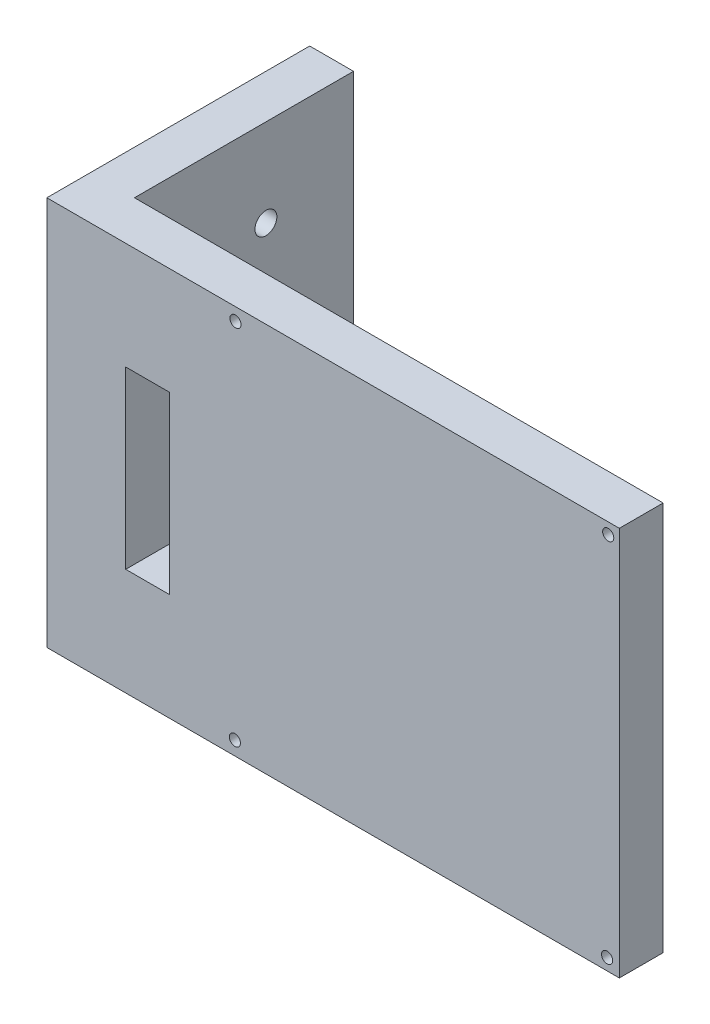
ISO-10303-21;
HEADER;
FILE_DESCRIPTION(('STEP AP214'),'2;1');
FILE_NAME('part.step','',(''),(''),'','','');
FILE_SCHEMA(('AUTOMOTIVE_DESIGN { 1 0 10303 214 1 1 1 1 }'));
ENDSEC;
DATA;
#1=APPLICATION_CONTEXT('core data for automotive mechanical design processes');
#2=APPLICATION_PROTOCOL_DEFINITION('international standard','automotive_design',2000,#1);
#3=PRODUCT_CONTEXT('',#1,'mechanical');
#4=PRODUCT('Part','Part','',(#3));
#5=PRODUCT_RELATED_PRODUCT_CATEGORY('part','',(#4));
#6=PRODUCT_DEFINITION_FORMATION('','',#4);
#7=PRODUCT_DEFINITION_CONTEXT('part definition',#1,'design');
#8=PRODUCT_DEFINITION('design','',#6,#7);
#9=PRODUCT_DEFINITION_SHAPE('','',#8);
#10=(LENGTH_UNIT() NAMED_UNIT(*) SI_UNIT(.MILLI.,.METRE.));
#11=(NAMED_UNIT(*) PLANE_ANGLE_UNIT() SI_UNIT($,.RADIAN.));
#12=(NAMED_UNIT(*) SI_UNIT($,.STERADIAN.) SOLID_ANGLE_UNIT());
#13=UNCERTAINTY_MEASURE_WITH_UNIT(LENGTH_MEASURE(1.E-05),#10,'distance_accuracy_value','');
#14=(GEOMETRIC_REPRESENTATION_CONTEXT(3) GLOBAL_UNCERTAINTY_ASSIGNED_CONTEXT((#13)) GLOBAL_UNIT_ASSIGNED_CONTEXT((#10,
#11,#12)) REPRESENTATION_CONTEXT('',''));
#15=CARTESIAN_POINT('',(0.,0.,0.));
#16=DIRECTION('',(0.,0.,1.));
#17=DIRECTION('',(1.,0.,0.));
#18=AXIS2_PLACEMENT_3D('',#15,#16,#17);
#19=CARTESIAN_POINT('',(0.,0.,10.));
#20=DIRECTION('',(0.,0.,1.));
#21=DIRECTION('',(1.,0.,0.));
#22=AXIS2_PLACEMENT_3D('',#19,#20,#21);
#23=PLANE('',#22);
#24=DIRECTION('',(0.,1.,0.));
#25=VECTOR('',#24,1.);
#26=CARTESIAN_POINT('',(-12.,64.45,10.));
#27=LINE('',#26,#25);
#28=CARTESIAN_POINT('',(-12.,24.45,10.));
#29=VERTEX_POINT('',#28);
#30=CARTESIAN_POINT('',(-12.,64.45,10.));
#31=VERTEX_POINT('',#30);
#32=EDGE_CURVE('E54',#29,#31,#27,.T.);
#33=ORIENTED_EDGE('',*,*,#32,.F.);
#34=DIRECTION('',(1.,0.,0.));
#35=VECTOR('',#34,1.);
#36=CARTESIAN_POINT('',(-22.,24.45,10.));
#37=LINE('',#36,#35);
#38=CARTESIAN_POINT('',(-22.,24.45,10.));
#39=VERTEX_POINT('',#38);
#40=EDGE_CURVE('E174',#39,#29,#37,.T.);
#41=ORIENTED_EDGE('',*,*,#40,.F.);
#42=DIRECTION('',(0.,-1.,0.));
#43=VECTOR('',#42,1.);
#44=CARTESIAN_POINT('',(-22.,64.45,10.));
#45=LINE('',#44,#43);
#46=CARTESIAN_POINT('',(-22.,64.45,10.));
#47=VERTEX_POINT('',#46);
#48=EDGE_CURVE('E191',#47,#39,#45,.T.);
#49=ORIENTED_EDGE('',*,*,#48,.F.);
#50=DIRECTION('',(-1.,0.,0.));
#51=VECTOR('',#50,1.);
#52=CARTESIAN_POINT('',(-22.,64.45,10.));
#53=LINE('',#52,#51);
#54=EDGE_CURVE('E187',#31,#47,#53,.T.);
#55=ORIENTED_EDGE('',*,*,#54,.F.);
#56=EDGE_LOOP('',(#33,#41,#49,#55));
#57=FACE_BOUND('',#56,.T.);
#58=CARTESIAN_POINT('',(87.884,2.66700000000001,10.));
#59=DIRECTION('',(0.,0.,1.));
#60=DIRECTION('',(1.,0.,0.));
#61=AXIS2_PLACEMENT_3D('',#58,#59,#60);
#62=CIRCLE('',#61,1.26999999999999);
#63=CARTESIAN_POINT('',(89.154,2.66700000000001,10.));
#64=VERTEX_POINT('',#63);
#65=EDGE_CURVE('E222',#64,#64,#62,.T.);
#66=ORIENTED_EDGE('',*,*,#65,.F.);
#67=EDGE_LOOP('',(#66));
#68=FACE_BOUND('',#67,.T.);
#69=CARTESIAN_POINT('',(2.92099999999999,3.17500000000001,10.));
#70=DIRECTION('',(0.,0.,1.));
#71=DIRECTION('',(1.,0.,0.));
#72=AXIS2_PLACEMENT_3D('',#69,#70,#71);
#73=CIRCLE('',#72,1.27000000000001);
#74=CARTESIAN_POINT('',(4.191,3.17500000000001,10.));
#75=VERTEX_POINT('',#74);
#76=EDGE_CURVE('E238',#75,#75,#73,.T.);
#77=ORIENTED_EDGE('',*,*,#76,.F.);
#78=EDGE_LOOP('',(#77));
#79=FACE_BOUND('',#78,.T.);
#80=DIRECTION('',(-1.,0.,0.));
#81=VECTOR('',#80,1.);
#82=CARTESIAN_POINT('',(90.678,88.9,10.));
#83=LINE('',#82,#81);
#84=CARTESIAN_POINT('',(90.678,88.9,10.));
#85=VERTEX_POINT('',#84);
#86=CARTESIAN_POINT('',(-40.,88.9,10.));
#87=VERTEX_POINT('',#86);
#88=EDGE_CURVE('E116',#85,#87,#83,.T.);
#89=ORIENTED_EDGE('',*,*,#88,.T.);
#90=DIRECTION('',(0.,1.,0.));
#91=VECTOR('',#90,1.);
#92=CARTESIAN_POINT('',(-40.,88.9,10.));
#93=LINE('',#92,#91);
#94=CARTESIAN_POINT('',(-40.,0.,10.));
#95=VERTEX_POINT('',#94);
#96=EDGE_CURVE('E120',#95,#87,#93,.T.);
#97=ORIENTED_EDGE('',*,*,#96,.F.);
#98=DIRECTION('',(1.,0.,0.));
#99=VECTOR('',#98,1.);
#100=CARTESIAN_POINT('',(0.,0.,10.));
#101=LINE('',#100,#99);
#102=CARTESIAN_POINT('',(90.678,0.,10.));
#103=VERTEX_POINT('',#102);
#104=EDGE_CURVE('E246',#95,#103,#101,.T.);
#105=ORIENTED_EDGE('',*,*,#104,.T.);
#106=DIRECTION('',(0.,1.,0.));
#107=VECTOR('',#106,1.);
#108=CARTESIAN_POINT('',(90.678,0.,10.));
#109=LINE('',#108,#107);
#110=EDGE_CURVE('E122',#103,#85,#109,.T.);
#111=ORIENTED_EDGE('',*,*,#110,.T.);
#112=EDGE_LOOP('',(#89,#97,#105,#111));
#113=FACE_BOUND('',#112,.T.);
#114=CARTESIAN_POINT('',(3.048,85.979,10.));
#115=DIRECTION('',(0.,0.,1.));
#116=DIRECTION('',(1.,0.,0.));
#117=AXIS2_PLACEMENT_3D('',#114,#115,#116);
#118=CIRCLE('',#117,1.26999999999999);
#119=CARTESIAN_POINT('',(4.31799999999999,85.979,10.));
#120=VERTEX_POINT('',#119);
#121=EDGE_CURVE('E230',#120,#120,#118,.T.);
#122=ORIENTED_EDGE('',*,*,#121,.F.);
#123=EDGE_LOOP('',(#122));
#124=FACE_BOUND('',#123,.T.);
#125=CARTESIAN_POINT('',(88.138,86.36,10.));
#126=DIRECTION('',(0.,0.,1.));
#127=DIRECTION('',(1.,0.,0.));
#128=AXIS2_PLACEMENT_3D('',#125,#126,#127);
#129=CIRCLE('',#128,1.26999999999999);
#130=CARTESIAN_POINT('',(89.408,86.36,10.));
#131=VERTEX_POINT('',#130);
#132=EDGE_CURVE('E214',#131,#131,#129,.T.);
#133=ORIENTED_EDGE('',*,*,#132,.F.);
#134=EDGE_LOOP('',(#133));
#135=FACE_BOUND('',#134,.T.);
#136=ADVANCED_FACE('F38',(#57,#68,#79,#113,#124,#135),#23,.T.);
#137=CARTESIAN_POINT('',(0.,0.,0.));
#138=DIRECTION('',(0.,0.,1.));
#139=DIRECTION('',(1.,0.,0.));
#140=AXIS2_PLACEMENT_3D('',#137,#138,#139);
#141=PLANE('',#140);
#142=DIRECTION('',(1.,0.,0.));
#143=VECTOR('',#142,1.);
#144=CARTESIAN_POINT('',(-22.,24.45,0.));
#145=LINE('',#144,#143);
#146=CARTESIAN_POINT('',(-22.,24.45,0.));
#147=VERTEX_POINT('',#146);
#148=CARTESIAN_POINT('',(-12.,24.45,0.));
#149=VERTEX_POINT('',#148);
#150=EDGE_CURVE('E180',#147,#149,#145,.T.);
#151=ORIENTED_EDGE('',*,*,#150,.T.);
#152=DIRECTION('',(0.,1.,0.));
#153=VECTOR('',#152,1.);
#154=CARTESIAN_POINT('',(-12.,64.45,0.));
#155=LINE('',#154,#153);
#156=CARTESIAN_POINT('',(-12.,64.45,0.));
#157=VERTEX_POINT('',#156);
#158=EDGE_CURVE('E169',#149,#157,#155,.T.);
#159=ORIENTED_EDGE('',*,*,#158,.T.);
#160=DIRECTION('',(-1.,0.,0.));
#161=VECTOR('',#160,1.);
#162=CARTESIAN_POINT('',(-22.,64.45,0.));
#163=LINE('',#162,#161);
#164=CARTESIAN_POINT('',(-22.,64.45,0.));
#165=VERTEX_POINT('',#164);
#166=EDGE_CURVE('E173',#157,#165,#163,.T.);
#167=ORIENTED_EDGE('',*,*,#166,.T.);
#168=DIRECTION('',(0.,-1.,0.));
#169=VECTOR('',#168,1.);
#170=CARTESIAN_POINT('',(-22.,64.45,0.));
#171=LINE('',#170,#169);
#172=EDGE_CURVE('E62',#165,#147,#171,.T.);
#173=ORIENTED_EDGE('',*,*,#172,.T.);
#174=EDGE_LOOP('',(#151,#159,#167,#173));
#175=FACE_BOUND('',#174,.T.);
#176=DIRECTION('',(1.,0.,0.));
#177=VECTOR('',#176,1.);
#178=CARTESIAN_POINT('',(0.,0.,0.));
#179=LINE('',#178,#177);
#180=CARTESIAN_POINT('',(-30.,0.,0.));
#181=VERTEX_POINT('',#180);
#182=CARTESIAN_POINT('',(90.678,0.,0.));
#183=VERTEX_POINT('',#182);
#184=EDGE_CURVE('E242',#181,#183,#179,.T.);
#185=ORIENTED_EDGE('',*,*,#184,.F.);
#186=DIRECTION('',(0.,-1.,0.));
#187=VECTOR('',#186,1.);
#188=CARTESIAN_POINT('',(-30.,88.9,0.));
#189=LINE('',#188,#187);
#190=CARTESIAN_POINT('',(-30.,88.9,0.));
#191=VERTEX_POINT('',#190);
#192=EDGE_CURVE('E201',#191,#181,#189,.T.);
#193=ORIENTED_EDGE('',*,*,#192,.F.);
#194=DIRECTION('',(-1.,0.,0.));
#195=VECTOR('',#194,1.);
#196=CARTESIAN_POINT('',(90.678,88.9,0.));
#197=LINE('',#196,#195);
#198=CARTESIAN_POINT('',(90.678,88.9,0.));
#199=VERTEX_POINT('',#198);
#200=EDGE_CURVE('E249',#199,#191,#197,.T.);
#201=ORIENTED_EDGE('',*,*,#200,.F.);
#202=DIRECTION('',(0.,1.,0.));
#203=VECTOR('',#202,1.);
#204=CARTESIAN_POINT('',(90.678,0.,0.));
#205=LINE('',#204,#203);
#206=EDGE_CURVE('E254',#183,#199,#205,.T.);
#207=ORIENTED_EDGE('',*,*,#206,.F.);
#208=EDGE_LOOP('',(#185,#193,#201,#207));
#209=FACE_BOUND('',#208,.T.);
#210=CARTESIAN_POINT('',(2.92099999999999,3.17500000000001,0.));
#211=DIRECTION('',(0.,0.,1.));
#212=DIRECTION('',(1.,0.,0.));
#213=AXIS2_PLACEMENT_3D('',#210,#211,#212);
#214=CIRCLE('',#213,1.27000000000001);
#215=CARTESIAN_POINT('',(4.191,3.17500000000001,0.));
#216=VERTEX_POINT('',#215);
#217=EDGE_CURVE('E234',#216,#216,#214,.T.);
#218=ORIENTED_EDGE('',*,*,#217,.T.);
#219=EDGE_LOOP('',(#218));
#220=FACE_BOUND('',#219,.T.);
#221=CARTESIAN_POINT('',(3.048,85.979,0.));
#222=DIRECTION('',(0.,0.,1.));
#223=DIRECTION('',(1.,0.,0.));
#224=AXIS2_PLACEMENT_3D('',#221,#222,#223);
#225=CIRCLE('',#224,1.26999999999999);
#226=CARTESIAN_POINT('',(4.31799999999999,85.979,0.));
#227=VERTEX_POINT('',#226);
#228=EDGE_CURVE('E226',#227,#227,#225,.T.);
#229=ORIENTED_EDGE('',*,*,#228,.T.);
#230=EDGE_LOOP('',(#229));
#231=FACE_BOUND('',#230,.T.);
#232=CARTESIAN_POINT('',(87.884,2.66700000000001,0.));
#233=DIRECTION('',(0.,0.,1.));
#234=DIRECTION('',(1.,0.,0.));
#235=AXIS2_PLACEMENT_3D('',#232,#233,#234);
#236=CIRCLE('',#235,1.26999999999999);
#237=CARTESIAN_POINT('',(89.154,2.66700000000001,0.));
#238=VERTEX_POINT('',#237);
#239=EDGE_CURVE('E218',#238,#238,#236,.T.);
#240=ORIENTED_EDGE('',*,*,#239,.T.);
#241=EDGE_LOOP('',(#240));
#242=FACE_BOUND('',#241,.T.);
#243=CARTESIAN_POINT('',(88.138,86.36,0.));
#244=DIRECTION('',(0.,0.,1.));
#245=DIRECTION('',(1.,0.,0.));
#246=AXIS2_PLACEMENT_3D('',#243,#244,#245);
#247=CIRCLE('',#246,1.26999999999999);
#248=CARTESIAN_POINT('',(89.408,86.36,0.));
#249=VERTEX_POINT('',#248);
#250=EDGE_CURVE('E213',#249,#249,#247,.T.);
#251=ORIENTED_EDGE('',*,*,#250,.T.);
#252=EDGE_LOOP('',(#251));
#253=FACE_BOUND('',#252,.T.);
#254=ADVANCED_FACE('F264',(#175,#209,#220,#231,#242,#253),#141,.F.);
#255=CARTESIAN_POINT('',(0.,0.,10.));
#256=DIRECTION('',(0.,1.,0.));
#257=DIRECTION('',(0.,0.,1.));
#258=AXIS2_PLACEMENT_3D('',#255,#256,#257);
#259=PLANE('',#258);
#260=ORIENTED_EDGE('',*,*,#184,.T.);
#261=DIRECTION('',(0.,0.,-1.));
#262=VECTOR('',#261,1.);
#263=CARTESIAN_POINT('',(90.678,0.,10.));
#264=LINE('',#263,#262);
#265=EDGE_CURVE('E11',#103,#183,#264,.T.);
#266=ORIENTED_EDGE('',*,*,#265,.F.);
#267=ORIENTED_EDGE('',*,*,#104,.F.);
#268=DIRECTION('',(0.,0.,1.));
#269=VECTOR('',#268,1.);
#270=CARTESIAN_POINT('',(-40.,0.,10.));
#271=LINE('',#270,#269);
#272=CARTESIAN_POINT('',(-40.,0.,-50.));
#273=VERTEX_POINT('',#272);
#274=EDGE_CURVE('E141',#273,#95,#271,.T.);
#275=ORIENTED_EDGE('',*,*,#274,.F.);
#276=DIRECTION('',(1.,0.,0.));
#277=VECTOR('',#276,1.);
#278=CARTESIAN_POINT('',(-40.,0.,-50.));
#279=LINE('',#278,#277);
#280=CARTESIAN_POINT('',(-30.,0.,-50.));
#281=VERTEX_POINT('',#280);
#282=EDGE_CURVE('E157',#273,#281,#279,.T.);
#283=ORIENTED_EDGE('',*,*,#282,.T.);
#284=DIRECTION('',(0.,0.,1.));
#285=VECTOR('',#284,1.);
#286=CARTESIAN_POINT('',(-30.,0.,10.));
#287=LINE('',#286,#285);
#288=EDGE_CURVE('E143',#281,#181,#287,.T.);
#289=ORIENTED_EDGE('',*,*,#288,.T.);
#290=EDGE_LOOP('',(#260,#266,#267,#275,#283,#289));
#291=FACE_BOUND('',#290,.T.);
#292=ADVANCED_FACE('F40',(#291),#259,.F.);
#293=CARTESIAN_POINT('',(90.678,0.,10.));
#294=DIRECTION('',(-1.,0.,0.));
#295=DIRECTION('',(0.,0.,1.));
#296=AXIS2_PLACEMENT_3D('',#293,#294,#295);
#297=PLANE('',#296);
#298=ORIENTED_EDGE('',*,*,#206,.T.);
#299=DIRECTION('',(0.,0.,-1.));
#300=VECTOR('',#299,1.);
#301=CARTESIAN_POINT('',(90.678,88.9,10.));
#302=LINE('',#301,#300);
#303=EDGE_CURVE('E47',#85,#199,#302,.T.);
#304=ORIENTED_EDGE('',*,*,#303,.F.);
#305=ORIENTED_EDGE('',*,*,#110,.F.);
#306=ORIENTED_EDGE('',*,*,#265,.T.);
#307=EDGE_LOOP('',(#298,#304,#305,#306));
#308=FACE_BOUND('',#307,.T.);
#309=ADVANCED_FACE('F276',(#308),#297,.F.);
#310=CARTESIAN_POINT('',(90.678,88.9,10.));
#311=DIRECTION('',(0.,-1.,0.));
#312=DIRECTION('',(0.,0.,-1.));
#313=AXIS2_PLACEMENT_3D('',#310,#311,#312);
#314=PLANE('',#313);
#315=ORIENTED_EDGE('',*,*,#200,.T.);
#316=DIRECTION('',(0.,0.,-1.));
#317=VECTOR('',#316,1.);
#318=CARTESIAN_POINT('',(-30.,88.9,10.));
#319=LINE('',#318,#317);
#320=CARTESIAN_POINT('',(-30.,88.9,-50.));
#321=VERTEX_POINT('',#320);
#322=EDGE_CURVE('E158',#191,#321,#319,.T.);
#323=ORIENTED_EDGE('',*,*,#322,.T.);
#324=DIRECTION('',(1.,0.,0.));
#325=VECTOR('',#324,1.);
#326=CARTESIAN_POINT('',(-40.,88.9,-50.));
#327=LINE('',#326,#325);
#328=CARTESIAN_POINT('',(-40.,88.9,-50.));
#329=VERTEX_POINT('',#328);
#330=EDGE_CURVE('E132',#329,#321,#327,.T.);
#331=ORIENTED_EDGE('',*,*,#330,.F.);
#332=DIRECTION('',(0.,0.,-1.));
#333=VECTOR('',#332,1.);
#334=CARTESIAN_POINT('',(-40.,88.9,10.));
#335=LINE('',#334,#333);
#336=EDGE_CURVE('E129',#87,#329,#335,.T.);
#337=ORIENTED_EDGE('',*,*,#336,.F.);
#338=ORIENTED_EDGE('',*,*,#88,.F.);
#339=ORIENTED_EDGE('',*,*,#303,.T.);
#340=EDGE_LOOP('',(#315,#323,#331,#337,#338,#339));
#341=FACE_BOUND('',#340,.T.);
#342=ADVANCED_FACE('F130',(#341),#314,.F.);
#343=CARTESIAN_POINT('',(2.92099999999999,3.17500000000001,10.));
#344=DIRECTION('',(0.,0.,-1.));
#345=DIRECTION('',(-1.,0.,0.));
#346=AXIS2_PLACEMENT_3D('',#343,#344,#345);
#347=CYLINDRICAL_SURFACE('',#346,1.27000000000001);
#348=ORIENTED_EDGE('',*,*,#76,.T.);
#349=EDGE_LOOP('',(#348));
#350=FACE_BOUND('',#349,.T.);
#351=ORIENTED_EDGE('',*,*,#217,.F.);
#352=EDGE_LOOP('',(#351));
#353=FACE_BOUND('',#352,.T.);
#354=ADVANCED_FACE('F282',(#350,#353),#347,.F.);
#355=CARTESIAN_POINT('',(3.048,85.979,10.));
#356=DIRECTION('',(0.,0.,-1.));
#357=DIRECTION('',(-1.,0.,0.));
#358=AXIS2_PLACEMENT_3D('',#355,#356,#357);
#359=CYLINDRICAL_SURFACE('',#358,1.26999999999999);
#360=ORIENTED_EDGE('',*,*,#121,.T.);
#361=EDGE_LOOP('',(#360));
#362=FACE_BOUND('',#361,.T.);
#363=ORIENTED_EDGE('',*,*,#228,.F.);
#364=EDGE_LOOP('',(#363));
#365=FACE_BOUND('',#364,.T.);
#366=ADVANCED_FACE('F296',(#362,#365),#359,.F.);
#367=CARTESIAN_POINT('',(87.884,2.66700000000001,10.));
#368=DIRECTION('',(0.,0.,-1.));
#369=DIRECTION('',(-1.,0.,0.));
#370=AXIS2_PLACEMENT_3D('',#367,#368,#369);
#371=CYLINDRICAL_SURFACE('',#370,1.26999999999999);
#372=ORIENTED_EDGE('',*,*,#65,.T.);
#373=EDGE_LOOP('',(#372));
#374=FACE_BOUND('',#373,.T.);
#375=ORIENTED_EDGE('',*,*,#239,.F.);
#376=EDGE_LOOP('',(#375));
#377=FACE_BOUND('',#376,.T.);
#378=ADVANCED_FACE('F300',(#374,#377),#371,.F.);
#379=CARTESIAN_POINT('',(88.138,86.36,10.));
#380=DIRECTION('',(0.,0.,-1.));
#381=DIRECTION('',(-1.,0.,0.));
#382=AXIS2_PLACEMENT_3D('',#379,#380,#381);
#383=CYLINDRICAL_SURFACE('',#382,1.26999999999999);
#384=ORIENTED_EDGE('',*,*,#132,.T.);
#385=EDGE_LOOP('',(#384));
#386=FACE_BOUND('',#385,.T.);
#387=ORIENTED_EDGE('',*,*,#250,.F.);
#388=EDGE_LOOP('',(#387));
#389=FACE_BOUND('',#388,.T.);
#390=ADVANCED_FACE('F304',(#386,#389),#383,.F.);
#391=CARTESIAN_POINT('',(-12.,64.45,0.));
#392=DIRECTION('',(1.,0.,0.));
#393=DIRECTION('',(0.,1.,0.));
#394=AXIS2_PLACEMENT_3D('',#391,#392,#393);
#395=PLANE('',#394);
#396=ORIENTED_EDGE('',*,*,#32,.T.);
#397=DIRECTION('',(0.,0.,1.));
#398=VECTOR('',#397,1.);
#399=CARTESIAN_POINT('',(-12.,64.45,0.));
#400=LINE('',#399,#398);
#401=EDGE_CURVE('E184',#157,#31,#400,.T.);
#402=ORIENTED_EDGE('',*,*,#401,.F.);
#403=ORIENTED_EDGE('',*,*,#158,.F.);
#404=DIRECTION('',(0.,0.,1.));
#405=VECTOR('',#404,1.);
#406=CARTESIAN_POINT('',(-12.,24.45,0.));
#407=LINE('',#406,#405);
#408=EDGE_CURVE('E198',#149,#29,#407,.T.);
#409=ORIENTED_EDGE('',*,*,#408,.T.);
#410=EDGE_LOOP('',(#396,#402,#403,#409));
#411=FACE_BOUND('',#410,.T.);
#412=ADVANCED_FACE('F308',(#411),#395,.F.);
#413=CARTESIAN_POINT('',(-22.,24.45,0.));
#414=DIRECTION('',(0.,-1.,0.));
#415=DIRECTION('',(0.,0.,-1.));
#416=AXIS2_PLACEMENT_3D('',#413,#414,#415);
#417=PLANE('',#416);
#418=ORIENTED_EDGE('',*,*,#40,.T.);
#419=ORIENTED_EDGE('',*,*,#408,.F.);
#420=ORIENTED_EDGE('',*,*,#150,.F.);
#421=DIRECTION('',(0.,0.,1.));
#422=VECTOR('',#421,1.);
#423=CARTESIAN_POINT('',(-22.,24.45,0.));
#424=LINE('',#423,#422);
#425=EDGE_CURVE('E202',#147,#39,#424,.T.);
#426=ORIENTED_EDGE('',*,*,#425,.T.);
#427=EDGE_LOOP('',(#418,#419,#420,#426));
#428=FACE_BOUND('',#427,.T.);
#429=ADVANCED_FACE('F312',(#428),#417,.F.);
#430=CARTESIAN_POINT('',(-22.,64.45,0.));
#431=DIRECTION('',(-1.,0.,0.));
#432=DIRECTION('',(0.,-1.,0.));
#433=AXIS2_PLACEMENT_3D('',#430,#431,#432);
#434=PLANE('',#433);
#435=ORIENTED_EDGE('',*,*,#48,.T.);
#436=ORIENTED_EDGE('',*,*,#425,.F.);
#437=ORIENTED_EDGE('',*,*,#172,.F.);
#438=DIRECTION('',(0.,0.,1.));
#439=VECTOR('',#438,1.);
#440=CARTESIAN_POINT('',(-22.,64.45,0.));
#441=LINE('',#440,#439);
#442=EDGE_CURVE('E205',#165,#47,#441,.T.);
#443=ORIENTED_EDGE('',*,*,#442,.T.);
#444=EDGE_LOOP('',(#435,#436,#437,#443));
#445=FACE_BOUND('',#444,.T.);
#446=ADVANCED_FACE('F316',(#445),#434,.F.);
#447=CARTESIAN_POINT('',(-22.,64.45,0.));
#448=DIRECTION('',(0.,1.,0.));
#449=DIRECTION('',(0.,0.,1.));
#450=AXIS2_PLACEMENT_3D('',#447,#448,#449);
#451=PLANE('',#450);
#452=ORIENTED_EDGE('',*,*,#54,.T.);
#453=ORIENTED_EDGE('',*,*,#442,.F.);
#454=ORIENTED_EDGE('',*,*,#166,.F.);
#455=ORIENTED_EDGE('',*,*,#401,.T.);
#456=EDGE_LOOP('',(#452,#453,#454,#455));
#457=FACE_BOUND('',#456,.T.);
#458=ADVANCED_FACE('F313',(#457),#451,.F.);
#459=CARTESIAN_POINT('',(-40.,88.9,-50.));
#460=DIRECTION('',(0.,0.,1.));
#461=DIRECTION('',(0.,-1.,0.));
#462=AXIS2_PLACEMENT_3D('',#459,#460,#461);
#463=PLANE('',#462);
#464=DIRECTION('',(0.,-1.,0.));
#465=VECTOR('',#464,1.);
#466=CARTESIAN_POINT('',(-30.,88.9,-50.));
#467=LINE('',#466,#465);
#468=EDGE_CURVE('E147',#321,#281,#467,.T.);
#469=ORIENTED_EDGE('',*,*,#468,.T.);
#470=ORIENTED_EDGE('',*,*,#282,.F.);
#471=DIRECTION('',(0.,-1.,0.));
#472=VECTOR('',#471,1.);
#473=CARTESIAN_POINT('',(-40.,88.9,-50.));
#474=LINE('',#473,#472);
#475=EDGE_CURVE('E136',#329,#273,#474,.T.);
#476=ORIENTED_EDGE('',*,*,#475,.F.);
#477=ORIENTED_EDGE('',*,*,#330,.T.);
#478=EDGE_LOOP('',(#469,#470,#476,#477));
#479=FACE_BOUND('',#478,.T.);
#480=ADVANCED_FACE('F272',(#479),#463,.F.);
#481=CARTESIAN_POINT('',(-40.,0.,0.));
#482=DIRECTION('',(1.,0.,0.));
#483=DIRECTION('',(0.,0.,-1.));
#484=AXIS2_PLACEMENT_3D('',#481,#482,#483);
#485=PLANE('',#484);
#486=CARTESIAN_POINT('',(-40.,68.9,-30.));
#487=DIRECTION('',(-1.,0.,0.));
#488=DIRECTION('',(0.,0.,-1.));
#489=AXIS2_PLACEMENT_3D('',#486,#487,#488);
#490=CIRCLE('',#489,2.5);
#491=CARTESIAN_POINT('',(-40.,68.9,-32.5));
#492=VERTEX_POINT('',#491);
#493=EDGE_CURVE('E373',#492,#492,#490,.T.);
#494=ORIENTED_EDGE('',*,*,#493,.F.);
#495=EDGE_LOOP('',(#494));
#496=FACE_BOUND('',#495,.T.);
#497=CARTESIAN_POINT('',(-40.,20.,-30.));
#498=DIRECTION('',(-1.,0.,0.));
#499=DIRECTION('',(0.,0.,1.));
#500=AXIS2_PLACEMENT_3D('',#497,#498,#499);
#501=CIRCLE('',#500,2.5);
#502=CARTESIAN_POINT('',(-40.,20.,-27.5));
#503=VERTEX_POINT('',#502);
#504=EDGE_CURVE('E363',#503,#503,#501,.T.);
#505=ORIENTED_EDGE('',*,*,#504,.F.);
#506=EDGE_LOOP('',(#505));
#507=FACE_BOUND('',#506,.T.);
#508=CARTESIAN_POINT('',(-40.,20.,-10.));
#509=DIRECTION('',(-1.,0.,0.));
#510=DIRECTION('',(0.,0.,-1.));
#511=AXIS2_PLACEMENT_3D('',#508,#509,#510);
#512=CIRCLE('',#511,2.5);
#513=CARTESIAN_POINT('',(-40.,20.,-12.5));
#514=VERTEX_POINT('',#513);
#515=EDGE_CURVE('E354',#514,#514,#512,.T.);
#516=ORIENTED_EDGE('',*,*,#515,.F.);
#517=EDGE_LOOP('',(#516));
#518=FACE_BOUND('',#517,.T.);
#519=CARTESIAN_POINT('',(-40.,68.9,-10.));
#520=DIRECTION('',(-1.,0.,0.));
#521=DIRECTION('',(0.,0.,1.));
#522=AXIS2_PLACEMENT_3D('',#519,#520,#521);
#523=CIRCLE('',#522,2.5);
#524=CARTESIAN_POINT('',(-40.,68.9,-7.5));
#525=VERTEX_POINT('',#524);
#526=EDGE_CURVE('E150',#525,#525,#523,.T.);
#527=ORIENTED_EDGE('',*,*,#526,.F.);
#528=EDGE_LOOP('',(#527));
#529=FACE_BOUND('',#528,.T.);
#530=ORIENTED_EDGE('',*,*,#96,.T.);
#531=ORIENTED_EDGE('',*,*,#336,.T.);
#532=ORIENTED_EDGE('',*,*,#475,.T.);
#533=ORIENTED_EDGE('',*,*,#274,.T.);
#534=EDGE_LOOP('',(#530,#531,#532,#533));
#535=FACE_BOUND('',#534,.T.);
#536=ADVANCED_FACE('F139',(#496,#507,#518,#529,#535),#485,.F.);
#537=CARTESIAN_POINT('',(-30.,0.,0.));
#538=DIRECTION('',(1.,0.,0.));
#539=DIRECTION('',(0.,0.,-1.));
#540=AXIS2_PLACEMENT_3D('',#537,#538,#539);
#541=PLANE('',#540);
#542=CARTESIAN_POINT('',(-30.,68.9,-30.));
#543=DIRECTION('',(-1.,0.,0.));
#544=DIRECTION('',(0.,0.,-1.));
#545=AXIS2_PLACEMENT_3D('',#542,#543,#544);
#546=CIRCLE('',#545,2.5);
#547=CARTESIAN_POINT('',(-30.,68.9,-32.5));
#548=VERTEX_POINT('',#547);
#549=EDGE_CURVE('E369',#548,#548,#546,.T.);
#550=ORIENTED_EDGE('',*,*,#549,.T.);
#551=EDGE_LOOP('',(#550));
#552=FACE_BOUND('',#551,.T.);
#553=CARTESIAN_POINT('',(-30.,20.,-30.));
#554=DIRECTION('',(-1.,0.,0.));
#555=DIRECTION('',(0.,0.,1.));
#556=AXIS2_PLACEMENT_3D('',#553,#554,#555);
#557=CIRCLE('',#556,2.5);
#558=CARTESIAN_POINT('',(-30.,20.,-27.5));
#559=VERTEX_POINT('',#558);
#560=EDGE_CURVE('E357',#559,#559,#557,.T.);
#561=ORIENTED_EDGE('',*,*,#560,.T.);
#562=EDGE_LOOP('',(#561));
#563=FACE_BOUND('',#562,.T.);
#564=CARTESIAN_POINT('',(-30.,20.,-10.));
#565=DIRECTION('',(-1.,0.,0.));
#566=DIRECTION('',(0.,0.,-1.));
#567=AXIS2_PLACEMENT_3D('',#564,#565,#566);
#568=CIRCLE('',#567,2.5);
#569=CARTESIAN_POINT('',(-30.,20.,-12.5));
#570=VERTEX_POINT('',#569);
#571=EDGE_CURVE('E351',#570,#570,#568,.T.);
#572=ORIENTED_EDGE('',*,*,#571,.T.);
#573=EDGE_LOOP('',(#572));
#574=FACE_BOUND('',#573,.T.);
#575=CARTESIAN_POINT('',(-30.,68.9,-10.));
#576=DIRECTION('',(-1.,0.,0.));
#577=DIRECTION('',(0.,0.,1.));
#578=AXIS2_PLACEMENT_3D('',#575,#576,#577);
#579=CIRCLE('',#578,2.5);
#580=CARTESIAN_POINT('',(-30.,68.9,-7.5));
#581=VERTEX_POINT('',#580);
#582=EDGE_CURVE('E161',#581,#581,#579,.T.);
#583=ORIENTED_EDGE('',*,*,#582,.T.);
#584=EDGE_LOOP('',(#583));
#585=FACE_BOUND('',#584,.T.);
#586=ORIENTED_EDGE('',*,*,#322,.F.);
#587=ORIENTED_EDGE('',*,*,#192,.T.);
#588=ORIENTED_EDGE('',*,*,#288,.F.);
#589=ORIENTED_EDGE('',*,*,#468,.F.);
#590=EDGE_LOOP('',(#586,#587,#588,#589));
#591=FACE_BOUND('',#590,.T.);
#592=ADVANCED_FACE('F270',(#552,#563,#574,#585,#591),#541,.T.);
#593=CARTESIAN_POINT('',(-30.,68.9,-10.));
#594=DIRECTION('',(-1.,0.,0.));
#595=DIRECTION('',(0.,0.,1.));
#596=AXIS2_PLACEMENT_3D('',#593,#594,#595);
#597=CYLINDRICAL_SURFACE('',#596,2.5);
#598=ORIENTED_EDGE('',*,*,#582,.F.);
#599=EDGE_LOOP('',(#598));
#600=FACE_BOUND('',#599,.T.);
#601=ORIENTED_EDGE('',*,*,#526,.T.);
#602=EDGE_LOOP('',(#601));
#603=FACE_BOUND('',#602,.T.);
#604=ADVANCED_FACE('F327',(#600,#603),#597,.F.);
#605=CARTESIAN_POINT('',(-30.,20.,-10.));
#606=DIRECTION('',(-1.,0.,0.));
#607=DIRECTION('',(0.,0.,1.));
#608=AXIS2_PLACEMENT_3D('',#605,#606,#607);
#609=CYLINDRICAL_SURFACE('',#608,2.5);
#610=ORIENTED_EDGE('',*,*,#571,.F.);
#611=EDGE_LOOP('',(#610));
#612=FACE_BOUND('',#611,.T.);
#613=ORIENTED_EDGE('',*,*,#515,.T.);
#614=EDGE_LOOP('',(#613));
#615=FACE_BOUND('',#614,.T.);
#616=ADVANCED_FACE('F334',(#612,#615),#609,.F.);
#617=CARTESIAN_POINT('',(-30.,20.,-30.));
#618=DIRECTION('',(-1.,0.,0.));
#619=DIRECTION('',(0.,0.,1.));
#620=AXIS2_PLACEMENT_3D('',#617,#618,#619);
#621=CYLINDRICAL_SURFACE('',#620,2.5);
#622=ORIENTED_EDGE('',*,*,#560,.F.);
#623=EDGE_LOOP('',(#622));
#624=FACE_BOUND('',#623,.T.);
#625=ORIENTED_EDGE('',*,*,#504,.T.);
#626=EDGE_LOOP('',(#625));
#627=FACE_BOUND('',#626,.T.);
#628=ADVANCED_FACE('F339',(#624,#627),#621,.F.);
#629=CARTESIAN_POINT('',(-30.,68.9,-30.));
#630=DIRECTION('',(-1.,0.,0.));
#631=DIRECTION('',(0.,0.,1.));
#632=AXIS2_PLACEMENT_3D('',#629,#630,#631);
#633=CYLINDRICAL_SURFACE('',#632,2.5);
#634=ORIENTED_EDGE('',*,*,#549,.F.);
#635=EDGE_LOOP('',(#634));
#636=FACE_BOUND('',#635,.T.);
#637=ORIENTED_EDGE('',*,*,#493,.T.);
#638=EDGE_LOOP('',(#637));
#639=FACE_BOUND('',#638,.T.);
#640=ADVANCED_FACE('F336',(#636,#639),#633,.F.);
#641=CLOSED_SHELL('',(#136,#254,#292,#309,#342,#354,#366,#378,#390,#412,#429,#446,#458,#480,
#536,#592,#604,#616,#628,#640));
#642=MANIFOLD_SOLID_BREP('B2',#641);
#643=ADVANCED_BREP_SHAPE_REPRESENTATION('',(#18,#642),#14);
#644=SHAPE_DEFINITION_REPRESENTATION(#9,#643);
ENDSEC;
END-ISO-10303-21;
